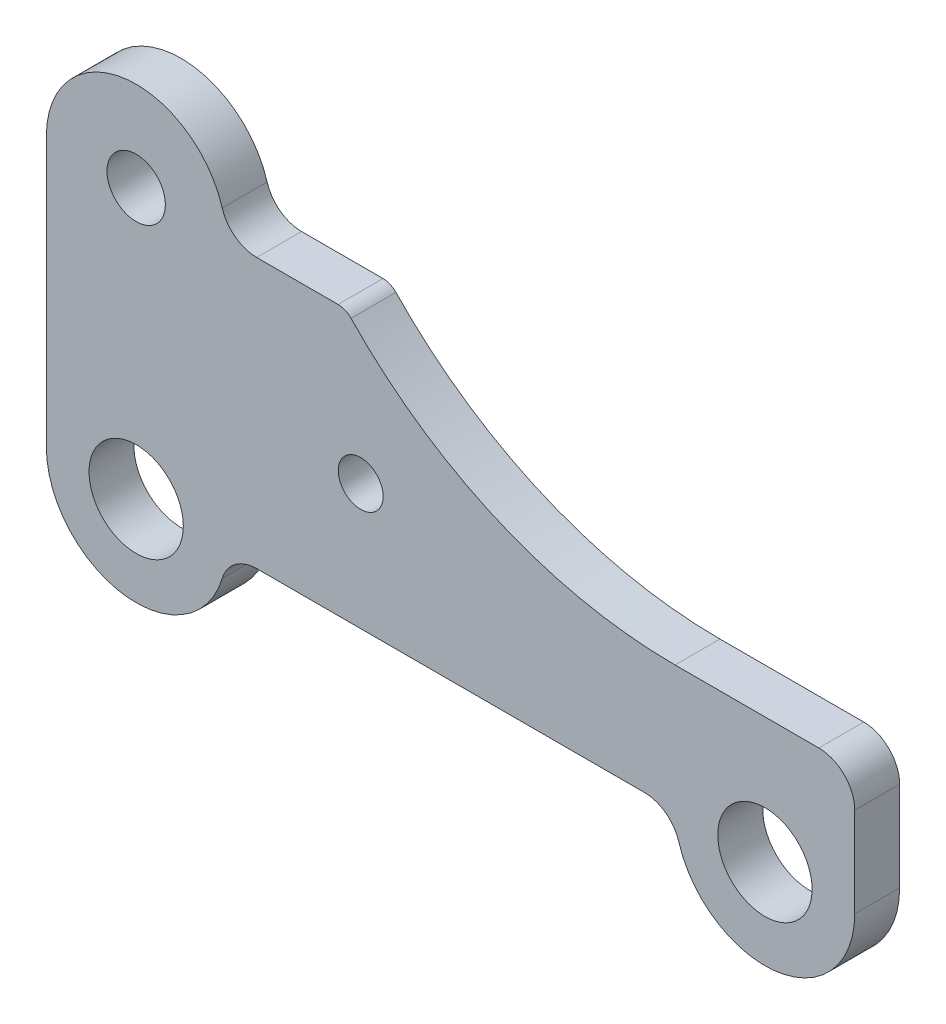
ISO-10303-21;
HEADER;
FILE_DESCRIPTION(('STEP AP214'),'2;1');
FILE_NAME('part.step','',(''),(''),'','','');
FILE_SCHEMA(('AUTOMOTIVE_DESIGN { 1 0 10303 214 1 1 1 1 }'));
ENDSEC;
DATA;
#1=APPLICATION_CONTEXT('core data for automotive mechanical design processes');
#2=APPLICATION_PROTOCOL_DEFINITION('international standard','automotive_design',2000,#1);
#3=PRODUCT_CONTEXT('',#1,'mechanical');
#4=PRODUCT('Part','Part','',(#3));
#5=PRODUCT_RELATED_PRODUCT_CATEGORY('part','',(#4));
#6=PRODUCT_DEFINITION_FORMATION('','',#4);
#7=PRODUCT_DEFINITION_CONTEXT('part definition',#1,'design');
#8=PRODUCT_DEFINITION('design','',#6,#7);
#9=PRODUCT_DEFINITION_SHAPE('','',#8);
#10=(LENGTH_UNIT() NAMED_UNIT(*) SI_UNIT(.MILLI.,.METRE.));
#11=(NAMED_UNIT(*) PLANE_ANGLE_UNIT() SI_UNIT($,.RADIAN.));
#12=(NAMED_UNIT(*) SI_UNIT($,.STERADIAN.) SOLID_ANGLE_UNIT());
#13=UNCERTAINTY_MEASURE_WITH_UNIT(LENGTH_MEASURE(1.E-05),#10,'distance_accuracy_value','');
#14=(GEOMETRIC_REPRESENTATION_CONTEXT(3) GLOBAL_UNCERTAINTY_ASSIGNED_CONTEXT((#13)) GLOBAL_UNIT_ASSIGNED_CONTEXT((#10,
#11,#12)) REPRESENTATION_CONTEXT('',''));
#15=CARTESIAN_POINT('',(0.,0.,0.));
#16=DIRECTION('',(0.,0.,1.));
#17=DIRECTION('',(1.,0.,0.));
#18=AXIS2_PLACEMENT_3D('',#15,#16,#17);
#19=CARTESIAN_POINT('',(10.,40.,2.5));
#20=DIRECTION('',(0.,0.,-1.));
#21=DIRECTION('',(-1.,0.,0.));
#22=AXIS2_PLACEMENT_3D('',#19,#20,#21);
#23=PLANE('',#22);
#24=CARTESIAN_POINT('',(10.,40.,2.5));
#25=DIRECTION('',(0.,0.,1.));
#26=DIRECTION('',(-1.,0.,0.));
#27=AXIS2_PLACEMENT_3D('',#24,#25,#26);
#28=CIRCLE('',#27,10.);
#29=CARTESIAN_POINT('',(19.5831484749991,42.8571428571429,2.5));
#30=VERTEX_POINT('',#29);
#31=CARTESIAN_POINT('',(0.,40.,2.5));
#32=VERTEX_POINT('',#31);
#33=EDGE_CURVE('E222',#30,#32,#28,.T.);
#34=ORIENTED_EDGE('',*,*,#33,.T.);
#35=DIRECTION('',(0.,-1.,0.));
#36=VECTOR('',#35,1.);
#37=CARTESIAN_POINT('',(0.,40.,2.5));
#38=LINE('',#37,#36);
#39=CARTESIAN_POINT('',(0.,10.,2.5));
#40=VERTEX_POINT('',#39);
#41=EDGE_CURVE('E122',#32,#40,#38,.T.);
#42=ORIENTED_EDGE('',*,*,#41,.T.);
#43=CARTESIAN_POINT('',(10.,10.,2.5));
#44=DIRECTION('',(0.,0.,1.));
#45=DIRECTION('',(1.,0.,0.));
#46=AXIS2_PLACEMENT_3D('',#43,#44,#45);
#47=CIRCLE('',#46,10.);
#48=CARTESIAN_POINT('',(19.5831484749991,7.14285714285715,2.5));
#49=VERTEX_POINT('',#48);
#50=EDGE_CURVE('E267',#40,#49,#47,.T.);
#51=ORIENTED_EDGE('',*,*,#50,.T.);
#52=CARTESIAN_POINT('',(23.4164078649987,6.,2.5));
#53=DIRECTION('',(0.,0.,-1.));
#54=DIRECTION('',(-1.,0.,0.));
#55=AXIS2_PLACEMENT_3D('',#52,#53,#54);
#56=CIRCLE('',#55,4.);
#57=CARTESIAN_POINT('',(23.4164078649987,10.,2.5));
#58=VERTEX_POINT('',#57);
#59=EDGE_CURVE('E287',#49,#58,#56,.T.);
#60=ORIENTED_EDGE('',*,*,#59,.T.);
#61=DIRECTION('',(1.,0.,0.));
#62=VECTOR('',#61,1.);
#63=CARTESIAN_POINT('',(23.4164078649987,10.,2.5));
#64=LINE('',#63,#62);
#65=CARTESIAN_POINT('',(66.5835921350013,10.,2.5));
#66=VERTEX_POINT('',#65);
#67=EDGE_CURVE('E283',#58,#66,#64,.T.);
#68=ORIENTED_EDGE('',*,*,#67,.T.);
#69=CARTESIAN_POINT('',(66.5835921350013,6.,2.5));
#70=DIRECTION('',(0.,0.,-1.));
#71=DIRECTION('',(-1.,0.,0.));
#72=AXIS2_PLACEMENT_3D('',#69,#70,#71);
#73=CIRCLE('',#72,4.);
#74=CARTESIAN_POINT('',(70.4168515250009,7.14285714285715,2.5));
#75=VERTEX_POINT('',#74);
#76=EDGE_CURVE('E286',#66,#75,#73,.T.);
#77=ORIENTED_EDGE('',*,*,#76,.T.);
#78=CARTESIAN_POINT('',(80.,10.,2.5));
#79=DIRECTION('',(0.,0.,1.));
#80=DIRECTION('',(1.,0.,0.));
#81=AXIS2_PLACEMENT_3D('',#78,#79,#80);
#82=CIRCLE('',#81,9.99999999999999);
#83=CARTESIAN_POINT('',(90.,10.,2.5));
#84=VERTEX_POINT('',#83);
#85=EDGE_CURVE('E291',#75,#84,#82,.T.);
#86=ORIENTED_EDGE('',*,*,#85,.T.);
#87=DIRECTION('',(0.,1.,0.));
#88=VECTOR('',#87,1.);
#89=CARTESIAN_POINT('',(90.,10.,2.5));
#90=LINE('',#89,#88);
#91=CARTESIAN_POINT('',(90.,20.,2.5));
#92=VERTEX_POINT('',#91);
#93=EDGE_CURVE('E298',#84,#92,#90,.T.);
#94=ORIENTED_EDGE('',*,*,#93,.T.);
#95=CARTESIAN_POINT('',(86.,20.,2.5));
#96=DIRECTION('',(0.,0.,1.));
#97=DIRECTION('',(1.,0.,0.));
#98=AXIS2_PLACEMENT_3D('',#95,#96,#97);
#99=CIRCLE('',#98,4.);
#100=CARTESIAN_POINT('',(86.,24.,2.5));
#101=VERTEX_POINT('',#100);
#102=EDGE_CURVE('E301',#92,#101,#99,.T.);
#103=ORIENTED_EDGE('',*,*,#102,.T.);
#104=DIRECTION('',(-1.,0.,0.));
#105=VECTOR('',#104,1.);
#106=CARTESIAN_POINT('',(86.,24.,2.5));
#107=LINE('',#106,#105);
#108=CARTESIAN_POINT('',(70.,24.,2.5));
#109=VERTEX_POINT('',#108);
#110=EDGE_CURVE('E304',#101,#109,#107,.T.);
#111=ORIENTED_EDGE('',*,*,#110,.T.);
#112=CARTESIAN_POINT('',(70.,74.,2.5));
#113=DIRECTION('',(0.,0.,-1.));
#114=DIRECTION('',(-1.,0.,0.));
#115=AXIS2_PLACEMENT_3D('',#112,#113,#114);
#116=CIRCLE('',#115,50.);
#117=CARTESIAN_POINT('',(33.919878770589,39.3846153846154,2.5));
#118=VERTEX_POINT('',#117);
#119=EDGE_CURVE('E159',#109,#118,#116,.T.);
#120=ORIENTED_EDGE('',*,*,#119,.T.);
#121=CARTESIAN_POINT('',(32.4766739214126,38.,2.5));
#122=DIRECTION('',(0.,0.,1.));
#123=DIRECTION('',(1.,0.,0.));
#124=AXIS2_PLACEMENT_3D('',#121,#122,#123);
#125=CIRCLE('',#124,2.);
#126=CARTESIAN_POINT('',(32.4766739214126,40.,2.5));
#127=VERTEX_POINT('',#126);
#128=EDGE_CURVE('E153',#118,#127,#125,.T.);
#129=ORIENTED_EDGE('',*,*,#128,.T.);
#130=DIRECTION('',(-1.,0.,0.));
#131=VECTOR('',#130,1.);
#132=CARTESIAN_POINT('',(32.4766739214126,40.,2.5));
#133=LINE('',#132,#131);
#134=CARTESIAN_POINT('',(23.4164078649987,40.,2.5));
#135=VERTEX_POINT('',#134);
#136=EDGE_CURVE('E157',#127,#135,#133,.T.);
#137=ORIENTED_EDGE('',*,*,#136,.T.);
#138=CARTESIAN_POINT('',(23.4164078649987,44.,2.5));
#139=DIRECTION('',(0.,0.,-1.));
#140=DIRECTION('',(-1.,0.,0.));
#141=AXIS2_PLACEMENT_3D('',#138,#139,#140);
#142=CIRCLE('',#141,4.);
#143=EDGE_CURVE('E61',#135,#30,#142,.T.);
#144=ORIENTED_EDGE('',*,*,#143,.T.);
#145=EDGE_LOOP('',(#34,#42,#51,#60,#68,#77,#86,#94,#103,#111,#120,#129,#137,#144));
#146=FACE_BOUND('',#145,.T.);
#147=CARTESIAN_POINT('',(10.,40.,2.5));
#148=DIRECTION('',(0.,0.,1.));
#149=DIRECTION('',(1.,0.,0.));
#150=AXIS2_PLACEMENT_3D('',#147,#148,#149);
#151=CIRCLE('',#150,3.25);
#152=CARTESIAN_POINT('',(13.25,40.,2.5));
#153=VERTEX_POINT('',#152);
#154=EDGE_CURVE('E186',#153,#153,#151,.T.);
#155=ORIENTED_EDGE('',*,*,#154,.F.);
#156=EDGE_LOOP('',(#155));
#157=FACE_BOUND('',#156,.T.);
#158=CARTESIAN_POINT('',(10.,10.,2.5));
#159=DIRECTION('',(0.,0.,1.));
#160=DIRECTION('',(1.,0.,0.));
#161=AXIS2_PLACEMENT_3D('',#158,#159,#160);
#162=CIRCLE('',#161,5.25);
#163=CARTESIAN_POINT('',(15.25,10.,2.5));
#164=VERTEX_POINT('',#163);
#165=EDGE_CURVE('E374',#164,#164,#162,.T.);
#166=ORIENTED_EDGE('',*,*,#165,.F.);
#167=EDGE_LOOP('',(#166));
#168=FACE_BOUND('',#167,.T.);
#169=CARTESIAN_POINT('',(80.,10.,2.5));
#170=DIRECTION('',(0.,0.,1.));
#171=DIRECTION('',(1.,0.,0.));
#172=AXIS2_PLACEMENT_3D('',#169,#170,#171);
#173=CIRCLE('',#172,5.25);
#174=CARTESIAN_POINT('',(85.25,10.,2.5));
#175=VERTEX_POINT('',#174);
#176=EDGE_CURVE('E366',#175,#175,#173,.T.);
#177=ORIENTED_EDGE('',*,*,#176,.F.);
#178=EDGE_LOOP('',(#177));
#179=FACE_BOUND('',#178,.T.);
#180=CARTESIAN_POINT('',(35.,24.,2.5));
#181=DIRECTION('',(0.,0.,1.));
#182=DIRECTION('',(1.,0.,0.));
#183=AXIS2_PLACEMENT_3D('',#180,#181,#182);
#184=CIRCLE('',#183,2.5);
#185=CARTESIAN_POINT('',(37.5,24.,2.5));
#186=VERTEX_POINT('',#185);
#187=EDGE_CURVE('E355',#186,#186,#184,.T.);
#188=ORIENTED_EDGE('',*,*,#187,.F.);
#189=EDGE_LOOP('',(#188));
#190=FACE_BOUND('',#189,.T.);
#191=ADVANCED_FACE('F43',(#146,#157,#168,#179,#190),#23,.F.);
#192=CARTESIAN_POINT('',(10.,40.,-2.5));
#193=DIRECTION('',(0.,0.,-1.));
#194=DIRECTION('',(-1.,0.,0.));
#195=AXIS2_PLACEMENT_3D('',#192,#193,#194);
#196=PLANE('',#195);
#197=CARTESIAN_POINT('',(80.,10.,-2.5));
#198=DIRECTION('',(0.,0.,1.));
#199=DIRECTION('',(1.,0.,0.));
#200=AXIS2_PLACEMENT_3D('',#197,#198,#199);
#201=CIRCLE('',#200,5.25);
#202=CARTESIAN_POINT('',(85.25,10.,-2.5));
#203=VERTEX_POINT('',#202);
#204=EDGE_CURVE('E363',#203,#203,#201,.T.);
#205=ORIENTED_EDGE('',*,*,#204,.T.);
#206=EDGE_LOOP('',(#205));
#207=FACE_BOUND('',#206,.T.);
#208=CARTESIAN_POINT('',(10.,40.,-2.5));
#209=DIRECTION('',(0.,0.,1.));
#210=DIRECTION('',(1.,0.,0.));
#211=AXIS2_PLACEMENT_3D('',#208,#209,#210);
#212=CIRCLE('',#211,3.25);
#213=CARTESIAN_POINT('',(13.25,40.,-2.5));
#214=VERTEX_POINT('',#213);
#215=EDGE_CURVE('E378',#214,#214,#212,.T.);
#216=ORIENTED_EDGE('',*,*,#215,.T.);
#217=EDGE_LOOP('',(#216));
#218=FACE_BOUND('',#217,.T.);
#219=CARTESIAN_POINT('',(10.,40.,-2.5));
#220=DIRECTION('',(0.,0.,1.));
#221=DIRECTION('',(-1.,0.,0.));
#222=AXIS2_PLACEMENT_3D('',#219,#220,#221);
#223=CIRCLE('',#222,10.);
#224=CARTESIAN_POINT('',(19.5831484749991,42.8571428571429,-2.5));
#225=VERTEX_POINT('',#224);
#226=CARTESIAN_POINT('',(0.,40.,-2.5));
#227=VERTEX_POINT('',#226);
#228=EDGE_CURVE('E181',#225,#227,#223,.T.);
#229=ORIENTED_EDGE('',*,*,#228,.F.);
#230=CARTESIAN_POINT('',(23.4164078649987,44.,-2.5));
#231=DIRECTION('',(0.,0.,-1.));
#232=DIRECTION('',(-1.,0.,0.));
#233=AXIS2_PLACEMENT_3D('',#230,#231,#232);
#234=CIRCLE('',#233,4.);
#235=CARTESIAN_POINT('',(23.4164078649987,40.,-2.5));
#236=VERTEX_POINT('',#235);
#237=EDGE_CURVE('E114',#236,#225,#234,.T.);
#238=ORIENTED_EDGE('',*,*,#237,.F.);
#239=DIRECTION('',(-1.,0.,0.));
#240=VECTOR('',#239,1.);
#241=CARTESIAN_POINT('',(32.4766739214126,40.,-2.5));
#242=LINE('',#241,#240);
#243=CARTESIAN_POINT('',(32.4766739214126,40.,-2.5));
#244=VERTEX_POINT('',#243);
#245=EDGE_CURVE('E108',#244,#236,#242,.T.);
#246=ORIENTED_EDGE('',*,*,#245,.F.);
#247=CARTESIAN_POINT('',(32.4766739214126,38.,-2.5));
#248=DIRECTION('',(0.,0.,1.));
#249=DIRECTION('',(1.,0.,0.));
#250=AXIS2_PLACEMENT_3D('',#247,#248,#249);
#251=CIRCLE('',#250,2.);
#252=CARTESIAN_POINT('',(33.919878770589,39.3846153846154,-2.5));
#253=VERTEX_POINT('',#252);
#254=EDGE_CURVE('E168',#253,#244,#251,.T.);
#255=ORIENTED_EDGE('',*,*,#254,.F.);
#256=CARTESIAN_POINT('',(70.,74.,-2.5));
#257=DIRECTION('',(0.,0.,-1.));
#258=DIRECTION('',(-1.,0.,0.));
#259=AXIS2_PLACEMENT_3D('',#256,#257,#258);
#260=CIRCLE('',#259,50.);
#261=CARTESIAN_POINT('',(70.,24.,-2.5));
#262=VERTEX_POINT('',#261);
#263=EDGE_CURVE('E213',#262,#253,#260,.T.);
#264=ORIENTED_EDGE('',*,*,#263,.F.);
#265=DIRECTION('',(-1.,0.,0.));
#266=VECTOR('',#265,1.);
#267=CARTESIAN_POINT('',(86.,24.,-2.5));
#268=LINE('',#267,#266);
#269=CARTESIAN_POINT('',(86.,24.,-2.5));
#270=VERTEX_POINT('',#269);
#271=EDGE_CURVE('E210',#270,#262,#268,.T.);
#272=ORIENTED_EDGE('',*,*,#271,.F.);
#273=CARTESIAN_POINT('',(86.,20.,-2.5));
#274=DIRECTION('',(0.,0.,1.));
#275=DIRECTION('',(1.,0.,0.));
#276=AXIS2_PLACEMENT_3D('',#273,#274,#275);
#277=CIRCLE('',#276,4.);
#278=CARTESIAN_POINT('',(90.,20.,-2.5));
#279=VERTEX_POINT('',#278);
#280=EDGE_CURVE('E207',#279,#270,#277,.T.);
#281=ORIENTED_EDGE('',*,*,#280,.F.);
#282=DIRECTION('',(0.,1.,0.));
#283=VECTOR('',#282,1.);
#284=CARTESIAN_POINT('',(90.,10.,-2.5));
#285=LINE('',#284,#283);
#286=CARTESIAN_POINT('',(90.,10.,-2.5));
#287=VERTEX_POINT('',#286);
#288=EDGE_CURVE('E204',#287,#279,#285,.T.);
#289=ORIENTED_EDGE('',*,*,#288,.F.);
#290=CARTESIAN_POINT('',(80.,10.,-2.5));
#291=DIRECTION('',(0.,0.,1.));
#292=DIRECTION('',(1.,0.,0.));
#293=AXIS2_PLACEMENT_3D('',#290,#291,#292);
#294=CIRCLE('',#293,9.99999999999999);
#295=CARTESIAN_POINT('',(70.4168515250009,7.14285714285715,-2.5));
#296=VERTEX_POINT('',#295);
#297=EDGE_CURVE('E201',#296,#287,#294,.T.);
#298=ORIENTED_EDGE('',*,*,#297,.F.);
#299=CARTESIAN_POINT('',(66.5835921350013,6.,-2.5));
#300=DIRECTION('',(0.,0.,-1.));
#301=DIRECTION('',(-1.,0.,0.));
#302=AXIS2_PLACEMENT_3D('',#299,#300,#301);
#303=CIRCLE('',#302,4.);
#304=CARTESIAN_POINT('',(66.5835921350013,10.,-2.5));
#305=VERTEX_POINT('',#304);
#306=EDGE_CURVE('E198',#305,#296,#303,.T.);
#307=ORIENTED_EDGE('',*,*,#306,.F.);
#308=DIRECTION('',(1.,0.,0.));
#309=VECTOR('',#308,1.);
#310=CARTESIAN_POINT('',(23.4164078649987,10.,-2.5));
#311=LINE('',#310,#309);
#312=CARTESIAN_POINT('',(23.4164078649987,10.,-2.5));
#313=VERTEX_POINT('',#312);
#314=EDGE_CURVE('E195',#313,#305,#311,.T.);
#315=ORIENTED_EDGE('',*,*,#314,.F.);
#316=CARTESIAN_POINT('',(23.4164078649987,6.,-2.5));
#317=DIRECTION('',(0.,0.,-1.));
#318=DIRECTION('',(-1.,0.,0.));
#319=AXIS2_PLACEMENT_3D('',#316,#317,#318);
#320=CIRCLE('',#319,4.);
#321=CARTESIAN_POINT('',(19.5831484749991,7.14285714285715,-2.5));
#322=VERTEX_POINT('',#321);
#323=EDGE_CURVE('E192',#322,#313,#320,.T.);
#324=ORIENTED_EDGE('',*,*,#323,.F.);
#325=CARTESIAN_POINT('',(10.,10.,-2.5));
#326=DIRECTION('',(0.,0.,1.));
#327=DIRECTION('',(1.,0.,0.));
#328=AXIS2_PLACEMENT_3D('',#325,#326,#327);
#329=CIRCLE('',#328,10.);
#330=CARTESIAN_POINT('',(0.,10.,-2.5));
#331=VERTEX_POINT('',#330);
#332=EDGE_CURVE('E189',#331,#322,#329,.T.);
#333=ORIENTED_EDGE('',*,*,#332,.F.);
#334=DIRECTION('',(0.,-1.,0.));
#335=VECTOR('',#334,1.);
#336=CARTESIAN_POINT('',(0.,40.,-2.5));
#337=LINE('',#336,#335);
#338=EDGE_CURVE('E185',#227,#331,#337,.T.);
#339=ORIENTED_EDGE('',*,*,#338,.F.);
#340=EDGE_LOOP('',(#229,#238,#246,#255,#264,#272,#281,#289,#298,#307,#315,#324,#333,#339));
#341=FACE_BOUND('',#340,.T.);
#342=CARTESIAN_POINT('',(10.,10.,-2.5));
#343=DIRECTION('',(0.,0.,1.));
#344=DIRECTION('',(1.,0.,0.));
#345=AXIS2_PLACEMENT_3D('',#342,#343,#344);
#346=CIRCLE('',#345,5.25);
#347=CARTESIAN_POINT('',(15.25,10.,-2.5));
#348=VERTEX_POINT('',#347);
#349=EDGE_CURVE('E370',#348,#348,#346,.T.);
#350=ORIENTED_EDGE('',*,*,#349,.T.);
#351=EDGE_LOOP('',(#350));
#352=FACE_BOUND('',#351,.T.);
#353=CARTESIAN_POINT('',(35.,24.,-2.5));
#354=DIRECTION('',(0.,0.,1.));
#355=DIRECTION('',(1.,0.,0.));
#356=AXIS2_PLACEMENT_3D('',#353,#354,#355);
#357=CIRCLE('',#356,2.5);
#358=CARTESIAN_POINT('',(37.5,24.,-2.5));
#359=VERTEX_POINT('',#358);
#360=EDGE_CURVE('E358',#359,#359,#357,.T.);
#361=ORIENTED_EDGE('',*,*,#360,.T.);
#362=EDGE_LOOP('',(#361));
#363=FACE_BOUND('',#362,.T.);
#364=ADVANCED_FACE('F271',(#207,#218,#341,#352,#363),#196,.T.);
#365=CARTESIAN_POINT('',(10.,40.,2.5));
#366=DIRECTION('',(0.,0.,-1.));
#367=DIRECTION('',(-1.,0.,0.));
#368=AXIS2_PLACEMENT_3D('',#365,#366,#367);
#369=CYLINDRICAL_SURFACE('',#368,10.);
#370=ORIENTED_EDGE('',*,*,#228,.T.);
#371=DIRECTION('',(0.,0.,-1.));
#372=VECTOR('',#371,1.);
#373=CARTESIAN_POINT('',(0.,40.,2.5));
#374=LINE('',#373,#372);
#375=EDGE_CURVE('E11',#32,#227,#374,.T.);
#376=ORIENTED_EDGE('',*,*,#375,.F.);
#377=ORIENTED_EDGE('',*,*,#33,.F.);
#378=DIRECTION('',(0.,0.,-1.));
#379=VECTOR('',#378,1.);
#380=CARTESIAN_POINT('',(19.5831484749991,42.8571428571429,2.5));
#381=LINE('',#380,#379);
#382=EDGE_CURVE('E177',#30,#225,#381,.T.);
#383=ORIENTED_EDGE('',*,*,#382,.T.);
#384=EDGE_LOOP('',(#370,#376,#377,#383));
#385=FACE_BOUND('',#384,.T.);
#386=ADVANCED_FACE('F45',(#385),#369,.T.);
#387=CARTESIAN_POINT('',(0.,40.,2.5));
#388=DIRECTION('',(1.,0.,0.));
#389=DIRECTION('',(0.,0.,-1.));
#390=AXIS2_PLACEMENT_3D('',#387,#388,#389);
#391=PLANE('',#390);
#392=ORIENTED_EDGE('',*,*,#338,.T.);
#393=DIRECTION('',(0.,0.,-1.));
#394=VECTOR('',#393,1.);
#395=CARTESIAN_POINT('',(0.,10.,2.5));
#396=LINE('',#395,#394);
#397=EDGE_CURVE('E53',#40,#331,#396,.T.);
#398=ORIENTED_EDGE('',*,*,#397,.F.);
#399=ORIENTED_EDGE('',*,*,#41,.F.);
#400=ORIENTED_EDGE('',*,*,#375,.T.);
#401=EDGE_LOOP('',(#392,#398,#399,#400));
#402=FACE_BOUND('',#401,.T.);
#403=ADVANCED_FACE('F528',(#402),#391,.F.);
#404=CARTESIAN_POINT('',(10.,10.,2.5));
#405=DIRECTION('',(0.,0.,-1.));
#406=DIRECTION('',(-1.,0.,0.));
#407=AXIS2_PLACEMENT_3D('',#404,#405,#406);
#408=CYLINDRICAL_SURFACE('',#407,10.);
#409=ORIENTED_EDGE('',*,*,#332,.T.);
#410=DIRECTION('',(0.,0.,-1.));
#411=VECTOR('',#410,1.);
#412=CARTESIAN_POINT('',(19.5831484749991,7.14285714285715,2.5));
#413=LINE('',#412,#411);
#414=EDGE_CURVE('E257',#49,#322,#413,.T.);
#415=ORIENTED_EDGE('',*,*,#414,.F.);
#416=ORIENTED_EDGE('',*,*,#50,.F.);
#417=ORIENTED_EDGE('',*,*,#397,.T.);
#418=EDGE_LOOP('',(#409,#415,#416,#417));
#419=FACE_BOUND('',#418,.T.);
#420=ADVANCED_FACE('F265',(#419),#408,.T.);
#421=CARTESIAN_POINT('',(23.4164078649987,6.,2.5));
#422=DIRECTION('',(0.,0.,-1.));
#423=DIRECTION('',(-1.,0.,0.));
#424=AXIS2_PLACEMENT_3D('',#421,#422,#423);
#425=CYLINDRICAL_SURFACE('',#424,4.);
#426=ORIENTED_EDGE('',*,*,#323,.T.);
#427=DIRECTION('',(0.,0.,-1.));
#428=VECTOR('',#427,1.);
#429=CARTESIAN_POINT('',(23.4164078649987,10.,2.5));
#430=LINE('',#429,#428);
#431=EDGE_CURVE('E253',#58,#313,#430,.T.);
#432=ORIENTED_EDGE('',*,*,#431,.F.);
#433=ORIENTED_EDGE('',*,*,#59,.F.);
#434=ORIENTED_EDGE('',*,*,#414,.T.);
#435=EDGE_LOOP('',(#426,#432,#433,#434));
#436=FACE_BOUND('',#435,.T.);
#437=ADVANCED_FACE('F277',(#436),#425,.F.);
#438=CARTESIAN_POINT('',(23.4164078649987,10.,2.5));
#439=DIRECTION('',(0.,1.,0.));
#440=DIRECTION('',(-1.,0.,0.));
#441=AXIS2_PLACEMENT_3D('',#438,#439,#440);
#442=PLANE('',#441);
#443=ORIENTED_EDGE('',*,*,#314,.T.);
#444=DIRECTION('',(0.,0.,-1.));
#445=VECTOR('',#444,1.);
#446=CARTESIAN_POINT('',(66.5835921350013,10.,2.5));
#447=LINE('',#446,#445);
#448=EDGE_CURVE('E249',#66,#305,#447,.T.);
#449=ORIENTED_EDGE('',*,*,#448,.F.);
#450=ORIENTED_EDGE('',*,*,#67,.F.);
#451=ORIENTED_EDGE('',*,*,#431,.T.);
#452=EDGE_LOOP('',(#443,#449,#450,#451));
#453=FACE_BOUND('',#452,.T.);
#454=ADVANCED_FACE('F281',(#453),#442,.F.);
#455=CARTESIAN_POINT('',(66.5835921350013,6.,2.5));
#456=DIRECTION('',(0.,0.,-1.));
#457=DIRECTION('',(-1.,0.,0.));
#458=AXIS2_PLACEMENT_3D('',#455,#456,#457);
#459=CYLINDRICAL_SURFACE('',#458,4.);
#460=ORIENTED_EDGE('',*,*,#306,.T.);
#461=DIRECTION('',(0.,0.,-1.));
#462=VECTOR('',#461,1.);
#463=CARTESIAN_POINT('',(70.4168515250009,7.14285714285715,2.5));
#464=LINE('',#463,#462);
#465=EDGE_CURVE('E245',#75,#296,#464,.T.);
#466=ORIENTED_EDGE('',*,*,#465,.F.);
#467=ORIENTED_EDGE('',*,*,#76,.F.);
#468=ORIENTED_EDGE('',*,*,#448,.T.);
#469=EDGE_LOOP('',(#460,#466,#467,#468));
#470=FACE_BOUND('',#469,.T.);
#471=ADVANCED_FACE('F489',(#470),#459,.F.);
#472=CARTESIAN_POINT('',(80.,10.,2.5));
#473=DIRECTION('',(0.,0.,-1.));
#474=DIRECTION('',(-1.,0.,0.));
#475=AXIS2_PLACEMENT_3D('',#472,#473,#474);
#476=CYLINDRICAL_SURFACE('',#475,9.99999999999999);
#477=ORIENTED_EDGE('',*,*,#297,.T.);
#478=DIRECTION('',(0.,0.,-1.));
#479=VECTOR('',#478,1.);
#480=CARTESIAN_POINT('',(90.,10.,2.5));
#481=LINE('',#480,#479);
#482=EDGE_CURVE('E241',#84,#287,#481,.T.);
#483=ORIENTED_EDGE('',*,*,#482,.F.);
#484=ORIENTED_EDGE('',*,*,#85,.F.);
#485=ORIENTED_EDGE('',*,*,#465,.T.);
#486=EDGE_LOOP('',(#477,#483,#484,#485));
#487=FACE_BOUND('',#486,.T.);
#488=ADVANCED_FACE('F478',(#487),#476,.T.);
#489=CARTESIAN_POINT('',(90.,10.,2.5));
#490=DIRECTION('',(-1.,0.,0.));
#491=DIRECTION('',(0.,0.,1.));
#492=AXIS2_PLACEMENT_3D('',#489,#490,#491);
#493=PLANE('',#492);
#494=ORIENTED_EDGE('',*,*,#288,.T.);
#495=DIRECTION('',(0.,0.,-1.));
#496=VECTOR('',#495,1.);
#497=CARTESIAN_POINT('',(90.,20.,2.5));
#498=LINE('',#497,#496);
#499=EDGE_CURVE('E237',#92,#279,#498,.T.);
#500=ORIENTED_EDGE('',*,*,#499,.F.);
#501=ORIENTED_EDGE('',*,*,#93,.F.);
#502=ORIENTED_EDGE('',*,*,#482,.T.);
#503=EDGE_LOOP('',(#494,#500,#501,#502));
#504=FACE_BOUND('',#503,.T.);
#505=ADVANCED_FACE('F467',(#504),#493,.F.);
#506=CARTESIAN_POINT('',(86.,20.,2.5));
#507=DIRECTION('',(0.,0.,-1.));
#508=DIRECTION('',(-1.,0.,0.));
#509=AXIS2_PLACEMENT_3D('',#506,#507,#508);
#510=CYLINDRICAL_SURFACE('',#509,4.);
#511=ORIENTED_EDGE('',*,*,#280,.T.);
#512=DIRECTION('',(0.,0.,-1.));
#513=VECTOR('',#512,1.);
#514=CARTESIAN_POINT('',(86.,24.,2.5));
#515=LINE('',#514,#513);
#516=EDGE_CURVE('E233',#101,#270,#515,.T.);
#517=ORIENTED_EDGE('',*,*,#516,.F.);
#518=ORIENTED_EDGE('',*,*,#102,.F.);
#519=ORIENTED_EDGE('',*,*,#499,.T.);
#520=EDGE_LOOP('',(#511,#517,#518,#519));
#521=FACE_BOUND('',#520,.T.);
#522=ADVANCED_FACE('F457',(#521),#510,.T.);
#523=CARTESIAN_POINT('',(86.,24.,2.5));
#524=DIRECTION('',(0.,-1.,0.));
#525=DIRECTION('',(1.,0.,0.));
#526=AXIS2_PLACEMENT_3D('',#523,#524,#525);
#527=PLANE('',#526);
#528=ORIENTED_EDGE('',*,*,#271,.T.);
#529=DIRECTION('',(0.,0.,-1.));
#530=VECTOR('',#529,1.);
#531=CARTESIAN_POINT('',(70.,24.,2.5));
#532=LINE('',#531,#530);
#533=EDGE_CURVE('E229',#109,#262,#532,.T.);
#534=ORIENTED_EDGE('',*,*,#533,.F.);
#535=ORIENTED_EDGE('',*,*,#110,.F.);
#536=ORIENTED_EDGE('',*,*,#516,.T.);
#537=EDGE_LOOP('',(#528,#534,#535,#536));
#538=FACE_BOUND('',#537,.T.);
#539=ADVANCED_FACE('F312',(#538),#527,.F.);
#540=CARTESIAN_POINT('',(70.,74.,2.5));
#541=DIRECTION('',(0.,0.,-1.));
#542=DIRECTION('',(-1.,0.,0.));
#543=AXIS2_PLACEMENT_3D('',#540,#541,#542);
#544=CYLINDRICAL_SURFACE('',#543,50.);
#545=ORIENTED_EDGE('',*,*,#263,.T.);
#546=DIRECTION('',(0.,0.,-1.));
#547=VECTOR('',#546,1.);
#548=CARTESIAN_POINT('',(33.919878770589,39.3846153846154,2.5));
#549=LINE('',#548,#547);
#550=EDGE_CURVE('E170',#118,#253,#549,.T.);
#551=ORIENTED_EDGE('',*,*,#550,.F.);
#552=ORIENTED_EDGE('',*,*,#119,.F.);
#553=ORIENTED_EDGE('',*,*,#533,.T.);
#554=EDGE_LOOP('',(#545,#551,#552,#553));
#555=FACE_BOUND('',#554,.T.);
#556=ADVANCED_FACE('F316',(#555),#544,.F.);
#557=CARTESIAN_POINT('',(32.4766739214126,38.,2.5));
#558=DIRECTION('',(0.,0.,-1.));
#559=DIRECTION('',(-1.,0.,0.));
#560=AXIS2_PLACEMENT_3D('',#557,#558,#559);
#561=CYLINDRICAL_SURFACE('',#560,2.);
#562=ORIENTED_EDGE('',*,*,#254,.T.);
#563=DIRECTION('',(0.,0.,-1.));
#564=VECTOR('',#563,1.);
#565=CARTESIAN_POINT('',(32.4766739214126,40.,2.5));
#566=LINE('',#565,#564);
#567=EDGE_CURVE('E165',#127,#244,#566,.T.);
#568=ORIENTED_EDGE('',*,*,#567,.F.);
#569=ORIENTED_EDGE('',*,*,#128,.F.);
#570=ORIENTED_EDGE('',*,*,#550,.T.);
#571=EDGE_LOOP('',(#562,#568,#569,#570));
#572=FACE_BOUND('',#571,.T.);
#573=ADVANCED_FACE('F166',(#572),#561,.T.);
#574=CARTESIAN_POINT('',(32.4766739214126,40.,2.5));
#575=DIRECTION('',(0.,-1.,0.));
#576=DIRECTION('',(1.,0.,0.));
#577=AXIS2_PLACEMENT_3D('',#574,#575,#576);
#578=PLANE('',#577);
#579=ORIENTED_EDGE('',*,*,#245,.T.);
#580=DIRECTION('',(0.,0.,-1.));
#581=VECTOR('',#580,1.);
#582=CARTESIAN_POINT('',(23.4164078649987,40.,2.5));
#583=LINE('',#582,#581);
#584=EDGE_CURVE('E171',#135,#236,#583,.T.);
#585=ORIENTED_EDGE('',*,*,#584,.F.);
#586=ORIENTED_EDGE('',*,*,#136,.F.);
#587=ORIENTED_EDGE('',*,*,#567,.T.);
#588=EDGE_LOOP('',(#579,#585,#586,#587));
#589=FACE_BOUND('',#588,.T.);
#590=ADVANCED_FACE('F173',(#589),#578,.F.);
#591=CARTESIAN_POINT('',(23.4164078649987,44.,2.5));
#592=DIRECTION('',(0.,0.,-1.));
#593=DIRECTION('',(-1.,0.,0.));
#594=AXIS2_PLACEMENT_3D('',#591,#592,#593);
#595=CYLINDRICAL_SURFACE('',#594,4.);
#596=ORIENTED_EDGE('',*,*,#237,.T.);
#597=ORIENTED_EDGE('',*,*,#382,.F.);
#598=ORIENTED_EDGE('',*,*,#143,.F.);
#599=ORIENTED_EDGE('',*,*,#584,.T.);
#600=EDGE_LOOP('',(#596,#597,#598,#599));
#601=FACE_BOUND('',#600,.T.);
#602=ADVANCED_FACE('F320',(#601),#595,.F.);
#603=CARTESIAN_POINT('',(10.,40.,2.5));
#604=DIRECTION('',(0.,0.,-1.));
#605=DIRECTION('',(-1.,0.,0.));
#606=AXIS2_PLACEMENT_3D('',#603,#604,#605);
#607=CYLINDRICAL_SURFACE('',#606,3.25);
#608=ORIENTED_EDGE('',*,*,#154,.T.);
#609=EDGE_LOOP('',(#608));
#610=FACE_BOUND('',#609,.T.);
#611=ORIENTED_EDGE('',*,*,#215,.F.);
#612=EDGE_LOOP('',(#611));
#613=FACE_BOUND('',#612,.T.);
#614=ADVANCED_FACE('F322',(#610,#613),#607,.F.);
#615=CARTESIAN_POINT('',(10.,10.,2.5));
#616=DIRECTION('',(0.,0.,-1.));
#617=DIRECTION('',(-1.,0.,0.));
#618=AXIS2_PLACEMENT_3D('',#615,#616,#617);
#619=CYLINDRICAL_SURFACE('',#618,5.25);
#620=ORIENTED_EDGE('',*,*,#165,.T.);
#621=EDGE_LOOP('',(#620));
#622=FACE_BOUND('',#621,.T.);
#623=ORIENTED_EDGE('',*,*,#349,.F.);
#624=EDGE_LOOP('',(#623));
#625=FACE_BOUND('',#624,.T.);
#626=ADVANCED_FACE('F328',(#622,#625),#619,.F.);
#627=CARTESIAN_POINT('',(80.,10.,2.5));
#628=DIRECTION('',(0.,0.,-1.));
#629=DIRECTION('',(-1.,0.,0.));
#630=AXIS2_PLACEMENT_3D('',#627,#628,#629);
#631=CYLINDRICAL_SURFACE('',#630,5.25);
#632=ORIENTED_EDGE('',*,*,#176,.T.);
#633=EDGE_LOOP('',(#632));
#634=FACE_BOUND('',#633,.T.);
#635=ORIENTED_EDGE('',*,*,#204,.F.);
#636=EDGE_LOOP('',(#635));
#637=FACE_BOUND('',#636,.T.);
#638=ADVANCED_FACE('F342',(#634,#637),#631,.F.);
#639=CARTESIAN_POINT('',(35.,24.,2.5));
#640=DIRECTION('',(0.,0.,-1.));
#641=DIRECTION('',(-1.,0.,0.));
#642=AXIS2_PLACEMENT_3D('',#639,#640,#641);
#643=CYLINDRICAL_SURFACE('',#642,2.5);
#644=ORIENTED_EDGE('',*,*,#187,.T.);
#645=EDGE_LOOP('',(#644));
#646=FACE_BOUND('',#645,.T.);
#647=ORIENTED_EDGE('',*,*,#360,.F.);
#648=EDGE_LOOP('',(#647));
#649=FACE_BOUND('',#648,.T.);
#650=ADVANCED_FACE('F346',(#646,#649),#643,.F.);
#651=CLOSED_SHELL('',(#191,#364,#386,#403,#420,#437,#454,#471,#488,#505,#522,#539,#556,#573,
#590,#602,#614,#626,#638,#650));
#652=MANIFOLD_SOLID_BREP('B2',#651);
#653=ADVANCED_BREP_SHAPE_REPRESENTATION('',(#18,#652),#14);
#654=SHAPE_DEFINITION_REPRESENTATION(#9,#653);
ENDSEC;
END-ISO-10303-21;
